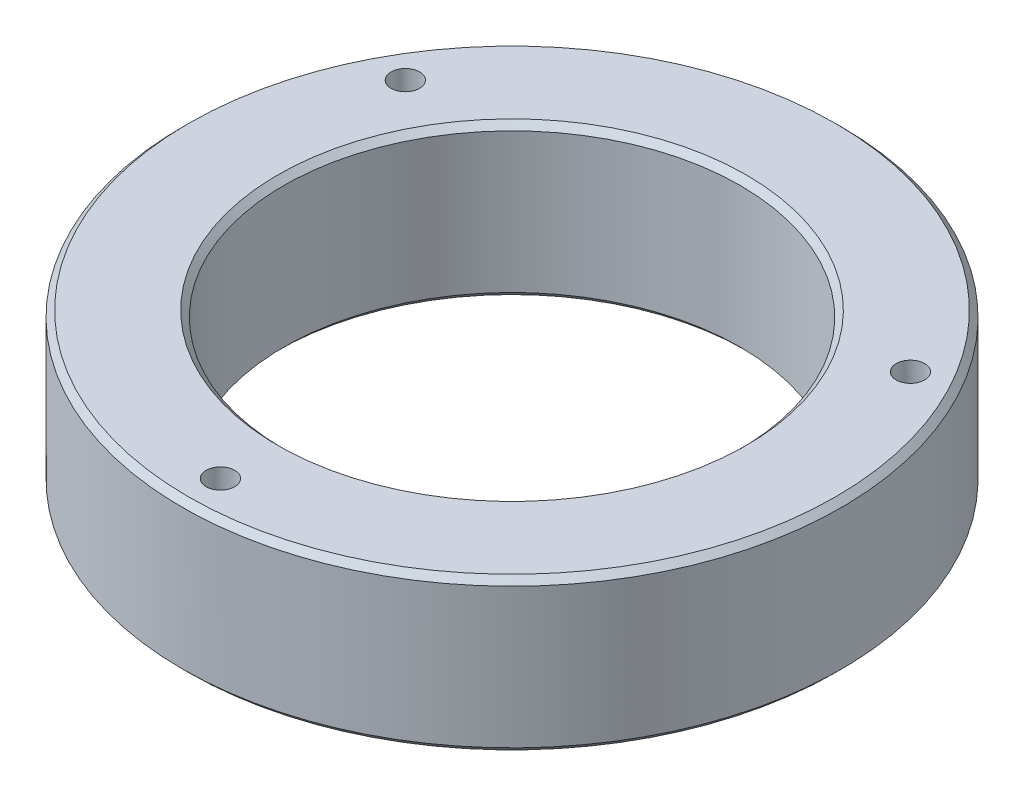
ISO-10303-21;
HEADER;
FILE_DESCRIPTION(('STEP AP214'),'2;1');
FILE_NAME('part.step','',(''),(''),'','','');
FILE_SCHEMA(('AUTOMOTIVE_DESIGN { 1 0 10303 214 1 1 1 1 }'));
ENDSEC;
DATA;
#1=APPLICATION_CONTEXT('core data for automotive mechanical design processes');
#2=APPLICATION_PROTOCOL_DEFINITION('international standard','automotive_design',2000,#1);
#3=PRODUCT_CONTEXT('',#1,'mechanical');
#4=PRODUCT('Part','Part','',(#3));
#5=PRODUCT_RELATED_PRODUCT_CATEGORY('part','',(#4));
#6=PRODUCT_DEFINITION_FORMATION('','',#4);
#7=PRODUCT_DEFINITION_CONTEXT('part definition',#1,'design');
#8=PRODUCT_DEFINITION('design','',#6,#7);
#9=PRODUCT_DEFINITION_SHAPE('','',#8);
#10=(LENGTH_UNIT() NAMED_UNIT(*) SI_UNIT(.MILLI.,.METRE.));
#11=(NAMED_UNIT(*) PLANE_ANGLE_UNIT() SI_UNIT($,.RADIAN.));
#12=(NAMED_UNIT(*) SI_UNIT($,.STERADIAN.) SOLID_ANGLE_UNIT());
#13=UNCERTAINTY_MEASURE_WITH_UNIT(LENGTH_MEASURE(1.E-05),#10,'distance_accuracy_value','');
#14=(GEOMETRIC_REPRESENTATION_CONTEXT(3) GLOBAL_UNCERTAINTY_ASSIGNED_CONTEXT((#13)) GLOBAL_UNIT_ASSIGNED_CONTEXT((#10,
#11,#12)) REPRESENTATION_CONTEXT('',''));
#15=CARTESIAN_POINT('',(0.,0.,0.));
#16=DIRECTION('',(0.,0.,1.));
#17=DIRECTION('',(1.,0.,0.));
#18=AXIS2_PLACEMENT_3D('',#15,#16,#17);
#19=CARTESIAN_POINT('',(-57.15,-19.05,0.));
#20=DIRECTION('',(0.,1.,0.));
#21=DIRECTION('',(0.,0.,1.));
#22=AXIS2_PLACEMENT_3D('',#19,#20,#21);
#23=PLANE('',#22);
#24=CARTESIAN_POINT('',(-69.85,-19.05,0.));
#25=DIRECTION('',(0.,1.,0.));
#26=DIRECTION('',(0.,0.,1.));
#27=AXIS2_PLACEMENT_3D('',#24,#25,#26);
#28=CIRCLE('',#27,3.96874999999999);
#29=CARTESIAN_POINT('',(-69.85,-19.05,3.96874999999999));
#30=VERTEX_POINT('',#29);
#31=EDGE_CURVE('E237',#30,#30,#28,.T.);
#32=ORIENTED_EDGE('',*,*,#31,.T.);
#33=EDGE_LOOP('',(#32));
#34=FACE_BOUND('',#33,.T.);
#35=CARTESIAN_POINT('',(69.85,-19.05,0.));
#36=DIRECTION('',(0.,1.,0.));
#37=DIRECTION('',(0.,0.,1.));
#38=AXIS2_PLACEMENT_3D('',#35,#36,#37);
#39=CIRCLE('',#38,3.96874999999999);
#40=CARTESIAN_POINT('',(69.85,-19.05,3.96874999999999));
#41=VERTEX_POINT('',#40);
#42=EDGE_CURVE('E96',#41,#41,#39,.T.);
#43=ORIENTED_EDGE('',*,*,#42,.T.);
#44=EDGE_LOOP('',(#43));
#45=FACE_BOUND('',#44,.T.);
#46=CARTESIAN_POINT('',(-63.246,-19.05,-36.5252));
#47=DIRECTION('',(0.,1.,0.));
#48=DIRECTION('',(0.,0.,1.));
#49=AXIS2_PLACEMENT_3D('',#46,#47,#48);
#50=CIRCLE('',#49,5.5626);
#51=CARTESIAN_POINT('',(-63.246,-19.05,-30.9626));
#52=VERTEX_POINT('',#51);
#53=EDGE_CURVE('E88',#52,#52,#50,.T.);
#54=ORIENTED_EDGE('',*,*,#53,.T.);
#55=EDGE_LOOP('',(#54));
#56=FACE_BOUND('',#55,.T.);
#57=CARTESIAN_POINT('',(63.246,-19.05,-36.5252));
#58=DIRECTION('',(0.,1.,0.));
#59=DIRECTION('',(0.,0.,1.));
#60=AXIS2_PLACEMENT_3D('',#57,#58,#59);
#61=CIRCLE('',#60,5.5626);
#62=CARTESIAN_POINT('',(63.246,-19.05,-30.9626));
#63=VERTEX_POINT('',#62);
#64=EDGE_CURVE('E78',#63,#63,#61,.T.);
#65=ORIENTED_EDGE('',*,*,#64,.T.);
#66=EDGE_LOOP('',(#65));
#67=FACE_BOUND('',#66,.T.);
#68=CARTESIAN_POINT('',(0.,-19.05,73.025));
#69=DIRECTION('',(0.,1.,0.));
#70=DIRECTION('',(0.,0.,1.));
#71=AXIS2_PLACEMENT_3D('',#68,#69,#70);
#72=CIRCLE('',#71,5.5626);
#73=CARTESIAN_POINT('',(0.,-19.05,78.5876));
#74=VERTEX_POINT('',#73);
#75=EDGE_CURVE('E72',#74,#74,#72,.T.);
#76=ORIENTED_EDGE('',*,*,#75,.T.);
#77=EDGE_LOOP('',(#76));
#78=FACE_BOUND('',#77,.T.);
#79=CARTESIAN_POINT('',(0.,-19.05,0.));
#80=DIRECTION('',(0.,1.,0.));
#81=DIRECTION('',(0.,0.,1.));
#82=AXIS2_PLACEMENT_3D('',#79,#80,#81);
#83=CIRCLE('',#82,58.674);
#84=CARTESIAN_POINT('',(0.,-19.05,-58.674));
#85=VERTEX_POINT('',#84);
#86=EDGE_CURVE('E57',#85,#85,#83,.T.);
#87=ORIENTED_EDGE('',*,*,#86,.T.);
#88=EDGE_LOOP('',(#87));
#89=FACE_BOUND('',#88,.T.);
#90=CARTESIAN_POINT('',(0.,-19.05,0.));
#91=DIRECTION('',(0.,1.,0.));
#92=DIRECTION('',(0.,0.,1.));
#93=AXIS2_PLACEMENT_3D('',#90,#91,#92);
#94=CIRCLE('',#93,81.0006);
#95=CARTESIAN_POINT('',(0.,-19.05,81.0006));
#96=VERTEX_POINT('',#95);
#97=EDGE_CURVE('E116',#96,#96,#94,.F.);
#98=ORIENTED_EDGE('',*,*,#97,.T.);
#99=EDGE_LOOP('',(#98));
#100=FACE_BOUND('',#99,.T.);
#101=ADVANCED_FACE('F43',(#34,#45,#56,#67,#78,#89,#100),#23,.F.);
#102=CARTESIAN_POINT('',(0.,-44.45,0.));
#103=DIRECTION('',(0.,-1.,0.));
#104=DIRECTION('',(0.,0.,-1.));
#105=AXIS2_PLACEMENT_3D('',#102,#103,#104);
#106=CYLINDRICAL_SURFACE('',#105,82.5246);
#107=CARTESIAN_POINT('',(0.,17.526,0.));
#108=DIRECTION('',(0.,-1.,0.));
#109=DIRECTION('',(0.,0.,-1.));
#110=AXIS2_PLACEMENT_3D('',#107,#108,#109);
#111=CIRCLE('',#110,82.5246);
#112=CARTESIAN_POINT('',(0.,17.526,-82.5246));
#113=VERTEX_POINT('',#112);
#114=EDGE_CURVE('E10',#113,#113,#111,.T.);
#115=ORIENTED_EDGE('',*,*,#114,.T.);
#116=EDGE_LOOP('',(#115));
#117=FACE_BOUND('',#116,.T.);
#118=CARTESIAN_POINT('',(0.,-17.526,0.));
#119=DIRECTION('',(0.,1.,0.));
#120=DIRECTION('',(0.,0.,1.));
#121=AXIS2_PLACEMENT_3D('',#118,#119,#120);
#122=CIRCLE('',#121,82.5246);
#123=CARTESIAN_POINT('',(0.,-17.526,82.5246));
#124=VERTEX_POINT('',#123);
#125=EDGE_CURVE('E52',#124,#124,#122,.T.);
#126=ORIENTED_EDGE('',*,*,#125,.T.);
#127=EDGE_LOOP('',(#126));
#128=FACE_BOUND('',#127,.T.);
#129=ADVANCED_FACE('F143',(#117,#128),#106,.T.);
#130=CARTESIAN_POINT('',(-82.5246,19.05,0.));
#131=DIRECTION('',(0.,-1.,0.));
#132=DIRECTION('',(0.,0.,-1.));
#133=AXIS2_PLACEMENT_3D('',#130,#131,#132);
#134=PLANE('',#133);
#135=CARTESIAN_POINT('',(-63.246,19.05,-36.5252));
#136=DIRECTION('',(0.,-1.,0.));
#137=DIRECTION('',(0.,0.,-1.));
#138=AXIS2_PLACEMENT_3D('',#135,#136,#137);
#139=CIRCLE('',#138,3.5687);
#140=CARTESIAN_POINT('',(-63.246,19.05,-40.0939));
#141=VERTEX_POINT('',#140);
#142=EDGE_CURVE('E76',#141,#141,#139,.F.);
#143=ORIENTED_EDGE('',*,*,#142,.F.);
#144=EDGE_LOOP('',(#143));
#145=FACE_BOUND('',#144,.T.);
#146=CARTESIAN_POINT('',(63.246,19.05,-36.5252));
#147=DIRECTION('',(0.,-1.,0.));
#148=DIRECTION('',(0.,0.,-1.));
#149=AXIS2_PLACEMENT_3D('',#146,#147,#148);
#150=CIRCLE('',#149,3.5687);
#151=CARTESIAN_POINT('',(63.246,19.05,-40.0939));
#152=VERTEX_POINT('',#151);
#153=EDGE_CURVE('E69',#152,#152,#150,.F.);
#154=ORIENTED_EDGE('',*,*,#153,.F.);
#155=EDGE_LOOP('',(#154));
#156=FACE_BOUND('',#155,.T.);
#157=CARTESIAN_POINT('',(0.,19.05,73.025));
#158=DIRECTION('',(0.,-1.,0.));
#159=DIRECTION('',(0.,0.,-1.));
#160=AXIS2_PLACEMENT_3D('',#157,#158,#159);
#161=CIRCLE('',#160,3.5687);
#162=CARTESIAN_POINT('',(0.,19.05,69.4563));
#163=VERTEX_POINT('',#162);
#164=EDGE_CURVE('E61',#163,#163,#161,.F.);
#165=ORIENTED_EDGE('',*,*,#164,.F.);
#166=EDGE_LOOP('',(#165));
#167=FACE_BOUND('',#166,.T.);
#168=CARTESIAN_POINT('',(0.,19.05,0.));
#169=DIRECTION('',(0.,-1.,0.));
#170=DIRECTION('',(0.,0.,-1.));
#171=AXIS2_PLACEMENT_3D('',#168,#169,#170);
#172=CIRCLE('',#171,58.674);
#173=CARTESIAN_POINT('',(0.,19.05,-58.674));
#174=VERTEX_POINT('',#173);
#175=EDGE_CURVE('E107',#174,#174,#172,.T.);
#176=ORIENTED_EDGE('',*,*,#175,.T.);
#177=EDGE_LOOP('',(#176));
#178=FACE_BOUND('',#177,.T.);
#179=CARTESIAN_POINT('',(0.,19.05,0.));
#180=DIRECTION('',(0.,-1.,0.));
#181=DIRECTION('',(0.,0.,-1.));
#182=AXIS2_PLACEMENT_3D('',#179,#180,#181);
#183=CIRCLE('',#182,81.0006);
#184=CARTESIAN_POINT('',(0.,19.05,-81.0006));
#185=VERTEX_POINT('',#184);
#186=EDGE_CURVE('E64',#185,#185,#183,.F.);
#187=ORIENTED_EDGE('',*,*,#186,.T.);
#188=EDGE_LOOP('',(#187));
#189=FACE_BOUND('',#188,.T.);
#190=ADVANCED_FACE('F133',(#145,#156,#167,#178,#189),#134,.F.);
#191=CARTESIAN_POINT('',(0.,-44.45,0.));
#192=DIRECTION('',(0.,-1.,0.));
#193=DIRECTION('',(0.,0.,-1.));
#194=AXIS2_PLACEMENT_3D('',#191,#192,#193);
#195=CYLINDRICAL_SURFACE('',#194,57.15);
#196=CARTESIAN_POINT('',(0.,17.526,0.));
#197=DIRECTION('',(0.,-1.,0.));
#198=DIRECTION('',(0.,0.,-1.));
#199=AXIS2_PLACEMENT_3D('',#196,#197,#198);
#200=CIRCLE('',#199,57.15);
#201=CARTESIAN_POINT('',(0.,17.526,-57.15));
#202=VERTEX_POINT('',#201);
#203=EDGE_CURVE('E113',#202,#202,#200,.F.);
#204=CARTESIAN_POINT('',(0.,-17.526,0.));
#205=DIRECTION('',(0.,1.,0.));
#206=DIRECTION('',(0.,0.,1.));
#207=AXIS2_PLACEMENT_3D('',#204,#205,#206);
#208=CIRCLE('',#207,57.15);
#209=CARTESIAN_POINT('',(0.,-17.526,-57.15));
#210=VERTEX_POINT('',#209);
#211=EDGE_CURVE('E110',#210,#210,#208,.F.);
#212=CARTESIAN_POINT('',(0.,17.526,-57.15));
#213=CARTESIAN_POINT('',(0.,17.160875,-57.15));
#214=CARTESIAN_POINT('',(0.,16.79575,-57.15));
#215=CARTESIAN_POINT('',(0.,16.0655,-57.15));
#216=CARTESIAN_POINT('',(0.,15.700375,-57.15));
#217=CARTESIAN_POINT('',(0.,14.970125,-57.15));
#218=CARTESIAN_POINT('',(0.,14.605,-57.15));
#219=CARTESIAN_POINT('',(0.,13.87475,-57.15));
#220=CARTESIAN_POINT('',(0.,13.509625,-57.15));
#221=CARTESIAN_POINT('',(0.,12.779375,-57.15));
#222=CARTESIAN_POINT('',(0.,12.41425,-57.15));
#223=CARTESIAN_POINT('',(0.,11.684,-57.15));
#224=CARTESIAN_POINT('',(0.,11.318875,-57.15));
#225=CARTESIAN_POINT('',(0.,10.588625,-57.15));
#226=CARTESIAN_POINT('',(0.,10.2235,-57.15));
#227=CARTESIAN_POINT('',(0.,9.49324999999998,-57.15));
#228=CARTESIAN_POINT('',(0.,9.12812499999998,-57.15));
#229=CARTESIAN_POINT('',(0.,8.39787499999998,-57.15));
#230=CARTESIAN_POINT('',(0.,8.03274999999998,-57.15));
#231=CARTESIAN_POINT('',(0.,7.30249999999998,-57.15));
#232=CARTESIAN_POINT('',(0.,6.93737499999998,-57.15));
#233=CARTESIAN_POINT('',(0.,6.20712499999998,-57.15));
#234=CARTESIAN_POINT('',(0.,5.84199999999998,-57.15));
#235=CARTESIAN_POINT('',(0.,5.11174999999998,-57.15));
#236=CARTESIAN_POINT('',(0.,4.74662499999998,-57.15));
#237=CARTESIAN_POINT('',(0.,4.01637499999998,-57.15));
#238=CARTESIAN_POINT('',(0.,3.65124999999998,-57.15));
#239=CARTESIAN_POINT('',(0.,2.92099999999998,-57.15));
#240=CARTESIAN_POINT('',(0.,2.55587499999998,-57.15));
#241=CARTESIAN_POINT('',(0.,1.82562499999998,-57.15));
#242=CARTESIAN_POINT('',(0.,1.46049999999998,-57.15));
#243=CARTESIAN_POINT('',(0.,0.730249999999976,-57.15));
#244=CARTESIAN_POINT('',(0.,0.365124999999978,-57.15));
#245=CARTESIAN_POINT('',(0.,-0.365125000000019,-57.15));
#246=CARTESIAN_POINT('',(0.,-0.730250000000018,-57.15));
#247=CARTESIAN_POINT('',(0.,-1.46050000000002,-57.15));
#248=CARTESIAN_POINT('',(0.,-1.82562500000002,-57.15));
#249=CARTESIAN_POINT('',(0.,-2.55587500000002,-57.15));
#250=CARTESIAN_POINT('',(0.,-2.92100000000002,-57.15));
#251=CARTESIAN_POINT('',(0.,-3.65125000000002,-57.15));
#252=CARTESIAN_POINT('',(0.,-4.01637500000002,-57.15));
#253=CARTESIAN_POINT('',(0.,-4.74662500000002,-57.15));
#254=CARTESIAN_POINT('',(0.,-5.11175000000002,-57.15));
#255=CARTESIAN_POINT('',(0.,-5.84200000000002,-57.15));
#256=CARTESIAN_POINT('',(0.,-6.20712500000002,-57.15));
#257=CARTESIAN_POINT('',(0.,-6.93737500000002,-57.15));
#258=CARTESIAN_POINT('',(0.,-7.30250000000002,-57.15));
#259=CARTESIAN_POINT('',(0.,-8.03275000000002,-57.15));
#260=CARTESIAN_POINT('',(0.,-8.39787500000002,-57.15));
#261=CARTESIAN_POINT('',(0.,-9.12812500000002,-57.15));
#262=CARTESIAN_POINT('',(0.,-9.49325000000002,-57.15));
#263=CARTESIAN_POINT('',(0.,-10.2235,-57.15));
#264=CARTESIAN_POINT('',(0.,-10.588625,-57.15));
#265=CARTESIAN_POINT('',(0.,-11.318875,-57.15));
#266=CARTESIAN_POINT('',(0.,-11.684,-57.15));
#267=CARTESIAN_POINT('',(0.,-12.41425,-57.15));
#268=CARTESIAN_POINT('',(0.,-12.779375,-57.15));
#269=CARTESIAN_POINT('',(0.,-13.509625,-57.15));
#270=CARTESIAN_POINT('',(0.,-13.87475,-57.15));
#271=CARTESIAN_POINT('',(0.,-14.605,-57.15));
#272=CARTESIAN_POINT('',(0.,-14.970125,-57.15));
#273=CARTESIAN_POINT('',(0.,-15.700375,-57.15));
#274=CARTESIAN_POINT('',(0.,-16.0655,-57.15));
#275=CARTESIAN_POINT('',(0.,-16.79575,-57.15));
#276=CARTESIAN_POINT('',(0.,-17.160875,-57.15));
#277=CARTESIAN_POINT('',(0.,-17.526,-57.15));
#278=B_SPLINE_CURVE_WITH_KNOTS('',3,(#212,#213,#214,#215,#216,#217,#218,#219,#220,#221,#222,
#223,#224,#225,#226,#227,#228,#229,#230,#231,#232,#233,#234,#235,#236,#237,#238,#239,#240,#241,
#242,#243,#244,#245,#246,#247,#248,#249,#250,#251,#252,#253,#254,#255,#256,#257,#258,#259,#260,
#261,#262,#263,#264,#265,#266,#267,#268,#269,#270,#271,#272,#273,#274,#275,#276,#277),
.UNSPECIFIED.,.F.,.F.,(4,2,2,2,2,2,2,2,2,2,2,2,2,2,2,2,2,2,2,2,2,2,2,2,2,2,2,2,2,2,2,2,4),(0.,
1.095375,2.19075,3.286125,4.3815,5.476875,6.57225,7.667625,8.763,9.858375,10.95375,12.049125,
13.1445,14.239875,15.33525,16.430625,17.526,18.621375,19.71675,20.812125,21.9075,23.002875,
24.09825,25.193625,26.289,27.384375,28.47975,29.575125,30.6705,31.765875,32.86125,33.956625,
35.052),.UNSPECIFIED.);
#279=EDGE_CURVE('BSEAM131',#202,#210,#278,.T.);
#280=ORIENTED_EDGE('',*,*,#203,.T.);
#281=ORIENTED_EDGE('',*,*,#211,.T.);
#282=ORIENTED_EDGE('',*,*,#279,.T.);
#283=ORIENTED_EDGE('',*,*,#279,.F.);
#284=EDGE_LOOP('',(#280,#282,#281,#283));
#285=FACE_BOUND('',#284,.T.);
#286=ADVANCED_FACE('F131',(#285),#195,.F.);
#287=CARTESIAN_POINT('',(0.,19.05,0.));
#288=DIRECTION('',(0.,1.,0.));
#289=DIRECTION('',(0.,0.,1.));
#290=AXIS2_PLACEMENT_3D('',#287,#288,#289);
#291=CONICAL_SURFACE('',#290,58.674,0.785398163397435);
#292=ORIENTED_EDGE('',*,*,#203,.F.);
#293=EDGE_LOOP('',(#292));
#294=FACE_BOUND('',#293,.T.);
#295=ORIENTED_EDGE('',*,*,#175,.F.);
#296=EDGE_LOOP('',(#295));
#297=FACE_BOUND('',#296,.T.);
#298=ADVANCED_FACE('F127',(#294,#297),#291,.F.);
#299=CARTESIAN_POINT('',(0.,-17.526,0.));
#300=DIRECTION('',(0.,-1.,0.));
#301=DIRECTION('',(0.,0.,-1.));
#302=AXIS2_PLACEMENT_3D('',#299,#300,#301);
#303=CONICAL_SURFACE('',#302,57.15,0.785398163397451);
#304=CARTESIAN_POINT('',(0.,-19.05,-58.674));
#305=CARTESIAN_POINT('',(0.,-19.034125,-58.658125));
#306=CARTESIAN_POINT('',(0.,-19.01825,-58.64225));
#307=CARTESIAN_POINT('',(0.,-18.9865,-58.6105));
#308=CARTESIAN_POINT('',(0.,-18.970625,-58.594625));
#309=CARTESIAN_POINT('',(0.,-18.938875,-58.562875));
#310=CARTESIAN_POINT('',(0.,-18.923,-58.547));
#311=CARTESIAN_POINT('',(0.,-18.89125,-58.51525));
#312=CARTESIAN_POINT('',(0.,-18.875375,-58.499375));
#313=CARTESIAN_POINT('',(0.,-18.843625,-58.467625));
#314=CARTESIAN_POINT('',(0.,-18.82775,-58.45175));
#315=CARTESIAN_POINT('',(0.,-18.796,-58.42));
#316=CARTESIAN_POINT('',(0.,-18.780125,-58.404125));
#317=CARTESIAN_POINT('',(0.,-18.748375,-58.372375));
#318=CARTESIAN_POINT('',(0.,-18.7325,-58.3565));
#319=CARTESIAN_POINT('',(0.,-18.70075,-58.32475));
#320=CARTESIAN_POINT('',(0.,-18.684875,-58.308875));
#321=CARTESIAN_POINT('',(0.,-18.653125,-58.277125));
#322=CARTESIAN_POINT('',(0.,-18.63725,-58.26125));
#323=CARTESIAN_POINT('',(0.,-18.6055,-58.2295));
#324=CARTESIAN_POINT('',(0.,-18.589625,-58.213625));
#325=CARTESIAN_POINT('',(0.,-18.557875,-58.181875));
#326=CARTESIAN_POINT('',(0.,-18.542,-58.166));
#327=CARTESIAN_POINT('',(0.,-18.51025,-58.13425));
#328=CARTESIAN_POINT('',(0.,-18.494375,-58.118375));
#329=CARTESIAN_POINT('',(0.,-18.462625,-58.086625));
#330=CARTESIAN_POINT('',(0.,-18.44675,-58.07075));
#331=CARTESIAN_POINT('',(0.,-18.415,-58.039));
#332=CARTESIAN_POINT('',(0.,-18.399125,-58.023125));
#333=CARTESIAN_POINT('',(0.,-18.367375,-57.991375));
#334=CARTESIAN_POINT('',(0.,-18.3515,-57.9755));
#335=CARTESIAN_POINT('',(0.,-18.31975,-57.94375));
#336=CARTESIAN_POINT('',(0.,-18.303875,-57.927875));
#337=CARTESIAN_POINT('',(0.,-18.272125,-57.896125));
#338=CARTESIAN_POINT('',(0.,-18.25625,-57.88025));
#339=CARTESIAN_POINT('',(0.,-18.2245,-57.8485));
#340=CARTESIAN_POINT('',(0.,-18.208625,-57.832625));
#341=CARTESIAN_POINT('',(0.,-18.176875,-57.800875));
#342=CARTESIAN_POINT('',(0.,-18.161,-57.785));
#343=CARTESIAN_POINT('',(0.,-18.12925,-57.75325));
#344=CARTESIAN_POINT('',(0.,-18.113375,-57.737375));
#345=CARTESIAN_POINT('',(0.,-18.081625,-57.705625));
#346=CARTESIAN_POINT('',(0.,-18.06575,-57.68975));
#347=CARTESIAN_POINT('',(0.,-18.034,-57.658));
#348=CARTESIAN_POINT('',(0.,-18.018125,-57.642125));
#349=CARTESIAN_POINT('',(0.,-17.986375,-57.610375));
#350=CARTESIAN_POINT('',(0.,-17.9705,-57.5945));
#351=CARTESIAN_POINT('',(0.,-17.93875,-57.56275));
#352=CARTESIAN_POINT('',(0.,-17.922875,-57.546875));
#353=CARTESIAN_POINT('',(0.,-17.891125,-57.515125));
#354=CARTESIAN_POINT('',(0.,-17.87525,-57.49925));
#355=CARTESIAN_POINT('',(0.,-17.8435,-57.4675));
#356=CARTESIAN_POINT('',(0.,-17.827625,-57.451625));
#357=CARTESIAN_POINT('',(0.,-17.795875,-57.419875));
#358=CARTESIAN_POINT('',(0.,-17.78,-57.404));
#359=CARTESIAN_POINT('',(0.,-17.74825,-57.37225));
#360=CARTESIAN_POINT('',(0.,-17.732375,-57.356375));
#361=CARTESIAN_POINT('',(0.,-17.700625,-57.324625));
#362=CARTESIAN_POINT('',(0.,-17.68475,-57.30875));
#363=CARTESIAN_POINT('',(0.,-17.653,-57.277));
#364=CARTESIAN_POINT('',(0.,-17.637125,-57.261125));
#365=CARTESIAN_POINT('',(0.,-17.605375,-57.229375));
#366=CARTESIAN_POINT('',(0.,-17.5895,-57.2135));
#367=CARTESIAN_POINT('',(0.,-17.55775,-57.18175));
#368=CARTESIAN_POINT('',(0.,-17.541875,-57.165875));
#369=CARTESIAN_POINT('',(0.,-17.526,-57.15));
#370=B_SPLINE_CURVE_WITH_KNOTS('',3,(#304,#305,#306,#307,#308,#309,#310,#311,#312,#313,#314,
#315,#316,#317,#318,#319,#320,#321,#322,#323,#324,#325,#326,#327,#328,#329,#330,#331,#332,#333,
#334,#335,#336,#337,#338,#339,#340,#341,#342,#343,#344,#345,#346,#347,#348,#349,#350,#351,#352,
#353,#354,#355,#356,#357,#358,#359,#360,#361,#362,#363,#364,#365,#366,#367,#368,#369),
.UNSPECIFIED.,.F.,.F.,(4,2,2,2,2,2,2,2,2,2,2,2,2,2,2,2,2,2,2,2,2,2,2,2,2,2,2,2,2,2,2,2,4),(0.,
0.0673519209080149,0.134703841816037,0.202055762724052,0.269407683632072,0.336759604540087,
0.404111525448106,0.471463446356126,0.538815367264141,0.606167288172161,0.673519209080176,
0.740871129988195,0.80822305089621,0.87557497180423,0.94292689271225,1.01027881362026,
1.07763073452828,1.1449826554363,1.21233457634432,1.27968649725234,1.34703841816036,
1.41439033906838,1.48174225997639,1.54909418088441,1.61644610179242,1.68379802270044,
1.75114994360846,1.81850186451648,1.88585378542449,1.95320570633251,2.02055762724053,
2.08790954814855,2.15526146905657),.UNSPECIFIED.);
#371=EDGE_CURVE('BSEAM123',#85,#210,#370,.T.);
#372=ORIENTED_EDGE('',*,*,#86,.F.);
#373=ORIENTED_EDGE('',*,*,#211,.F.);
#374=ORIENTED_EDGE('',*,*,#371,.T.);
#375=ORIENTED_EDGE('',*,*,#371,.F.);
#376=EDGE_LOOP('',(#372,#374,#373,#375));
#377=FACE_BOUND('',#376,.T.);
#378=ADVANCED_FACE('F123',(#377),#303,.F.);
#379=CARTESIAN_POINT('',(0.,17.526,0.));
#380=DIRECTION('',(0.,-1.,0.));
#381=DIRECTION('',(0.,0.,-1.));
#382=AXIS2_PLACEMENT_3D('',#379,#380,#381);
#383=CONICAL_SURFACE('',#382,82.5246,0.785398163397451);
#384=ORIENTED_EDGE('',*,*,#186,.F.);
#385=EDGE_LOOP('',(#384));
#386=FACE_BOUND('',#385,.T.);
#387=ORIENTED_EDGE('',*,*,#114,.F.);
#388=EDGE_LOOP('',(#387));
#389=FACE_BOUND('',#388,.T.);
#390=ADVANCED_FACE('F126',(#386,#389),#383,.T.);
#391=CARTESIAN_POINT('',(0.,-19.05,0.));
#392=DIRECTION('',(0.,1.,0.));
#393=DIRECTION('',(0.,0.,1.));
#394=AXIS2_PLACEMENT_3D('',#391,#392,#393);
#395=CONICAL_SURFACE('',#394,81.0006,0.785398163397448);
#396=ORIENTED_EDGE('',*,*,#125,.F.);
#397=EDGE_LOOP('',(#396));
#398=FACE_BOUND('',#397,.T.);
#399=ORIENTED_EDGE('',*,*,#97,.F.);
#400=EDGE_LOOP('',(#399));
#401=FACE_BOUND('',#400,.T.);
#402=ADVANCED_FACE('F46',(#398,#401),#395,.T.);
#403=CARTESIAN_POINT('',(0.,57.15,73.025));
#404=DIRECTION('',(0.,-1.,0.));
#405=DIRECTION('',(0.,0.,-1.));
#406=AXIS2_PLACEMENT_3D('',#403,#404,#405);
#407=CYLINDRICAL_SURFACE('',#406,3.5687);
#408=CARTESIAN_POINT('',(0.,-9.398,73.025));
#409=DIRECTION('',(0.,1.,0.));
#410=DIRECTION('',(0.,0.,1.));
#411=AXIS2_PLACEMENT_3D('',#408,#409,#410);
#412=CIRCLE('',#411,3.5687);
#413=CARTESIAN_POINT('',(0.,-9.398,76.5937));
#414=VERTEX_POINT('',#413);
#415=EDGE_CURVE('E65',#414,#414,#412,.T.);
#416=ORIENTED_EDGE('',*,*,#415,.F.);
#417=EDGE_LOOP('',(#416));
#418=FACE_BOUND('',#417,.T.);
#419=ORIENTED_EDGE('',*,*,#164,.T.);
#420=EDGE_LOOP('',(#419));
#421=FACE_BOUND('',#420,.T.);
#422=ADVANCED_FACE('F171',(#418,#421),#407,.F.);
#423=CARTESIAN_POINT('',(0.,-9.398,73.025));
#424=DIRECTION('',(0.,-1.,0.));
#425=DIRECTION('',(0.,0.,-1.));
#426=AXIS2_PLACEMENT_3D('',#423,#424,#425);
#427=CYLINDRICAL_SURFACE('',#426,5.5626);
#428=CARTESIAN_POINT('',(0.,-9.398,73.025));
#429=DIRECTION('',(0.,1.,0.));
#430=DIRECTION('',(0.,0.,1.));
#431=AXIS2_PLACEMENT_3D('',#428,#429,#430);
#432=CIRCLE('',#431,5.5626);
#433=CARTESIAN_POINT('',(0.,-9.398,78.5876));
#434=VERTEX_POINT('',#433);
#435=EDGE_CURVE('E68',#434,#434,#432,.T.);
#436=ORIENTED_EDGE('',*,*,#435,.T.);
#437=EDGE_LOOP('',(#436));
#438=FACE_BOUND('',#437,.T.);
#439=ORIENTED_EDGE('',*,*,#75,.F.);
#440=EDGE_LOOP('',(#439));
#441=FACE_BOUND('',#440,.T.);
#442=ADVANCED_FACE('F179',(#438,#441),#427,.F.);
#443=CARTESIAN_POINT('',(0.,-9.398,73.025));
#444=DIRECTION('',(0.,1.,0.));
#445=DIRECTION('',(0.,0.,1.));
#446=AXIS2_PLACEMENT_3D('',#443,#444,#445);
#447=PLANE('',#446);
#448=ORIENTED_EDGE('',*,*,#415,.T.);
#449=EDGE_LOOP('',(#448));
#450=FACE_BOUND('',#449,.T.);
#451=ORIENTED_EDGE('',*,*,#435,.F.);
#452=EDGE_LOOP('',(#451));
#453=FACE_BOUND('',#452,.T.);
#454=ADVANCED_FACE('F188',(#450,#453),#447,.F.);
#455=CARTESIAN_POINT('',(63.246,57.15,-36.5252));
#456=DIRECTION('',(0.,-1.,0.));
#457=DIRECTION('',(0.,0.,-1.));
#458=AXIS2_PLACEMENT_3D('',#455,#456,#457);
#459=CYLINDRICAL_SURFACE('',#458,3.5687);
#460=CARTESIAN_POINT('',(63.246,-9.398,-36.5252));
#461=DIRECTION('',(0.,1.,0.));
#462=DIRECTION('',(0.,0.,1.));
#463=AXIS2_PLACEMENT_3D('',#460,#461,#462);
#464=CIRCLE('',#463,3.5687);
#465=CARTESIAN_POINT('',(63.246,-9.398,-32.9565));
#466=VERTEX_POINT('',#465);
#467=EDGE_CURVE('E73',#466,#466,#464,.T.);
#468=ORIENTED_EDGE('',*,*,#467,.F.);
#469=EDGE_LOOP('',(#468));
#470=FACE_BOUND('',#469,.T.);
#471=ORIENTED_EDGE('',*,*,#153,.T.);
#472=EDGE_LOOP('',(#471));
#473=FACE_BOUND('',#472,.T.);
#474=ADVANCED_FACE('F196',(#470,#473),#459,.F.);
#475=CARTESIAN_POINT('',(63.246,-9.398,-36.5252));
#476=DIRECTION('',(0.,-1.,0.));
#477=DIRECTION('',(0.,0.,-1.));
#478=AXIS2_PLACEMENT_3D('',#475,#476,#477);
#479=CYLINDRICAL_SURFACE('',#478,5.5626);
#480=CARTESIAN_POINT('',(63.246,-9.398,-36.5252));
#481=DIRECTION('',(0.,1.,0.));
#482=DIRECTION('',(0.,0.,1.));
#483=AXIS2_PLACEMENT_3D('',#480,#481,#482);
#484=CIRCLE('',#483,5.5626);
#485=CARTESIAN_POINT('',(63.246,-9.398,-30.9626));
#486=VERTEX_POINT('',#485);
#487=EDGE_CURVE('E75',#486,#486,#484,.T.);
#488=ORIENTED_EDGE('',*,*,#487,.T.);
#489=EDGE_LOOP('',(#488));
#490=FACE_BOUND('',#489,.T.);
#491=ORIENTED_EDGE('',*,*,#64,.F.);
#492=EDGE_LOOP('',(#491));
#493=FACE_BOUND('',#492,.T.);
#494=ADVANCED_FACE('F200',(#490,#493),#479,.F.);
#495=CARTESIAN_POINT('',(63.246,-9.398,-36.5252));
#496=DIRECTION('',(0.,1.,0.));
#497=DIRECTION('',(0.,0.,1.));
#498=AXIS2_PLACEMENT_3D('',#495,#496,#497);
#499=PLANE('',#498);
#500=ORIENTED_EDGE('',*,*,#467,.T.);
#501=EDGE_LOOP('',(#500));
#502=FACE_BOUND('',#501,.T.);
#503=ORIENTED_EDGE('',*,*,#487,.F.);
#504=EDGE_LOOP('',(#503));
#505=FACE_BOUND('',#504,.T.);
#506=ADVANCED_FACE('F204',(#502,#505),#499,.F.);
#507=CARTESIAN_POINT('',(-63.246,57.15,-36.5252));
#508=DIRECTION('',(0.,-1.,0.));
#509=DIRECTION('',(0.,0.,-1.));
#510=AXIS2_PLACEMENT_3D('',#507,#508,#509);
#511=CYLINDRICAL_SURFACE('',#510,3.5687);
#512=CARTESIAN_POINT('',(-63.246,-9.398,-36.5252));
#513=DIRECTION('',(0.,1.,0.));
#514=DIRECTION('',(0.,0.,1.));
#515=AXIS2_PLACEMENT_3D('',#512,#513,#514);
#516=CIRCLE('',#515,3.5687);
#517=CARTESIAN_POINT('',(-63.246,-9.398,-32.9565));
#518=VERTEX_POINT('',#517);
#519=EDGE_CURVE('E48',#518,#518,#516,.T.);
#520=ORIENTED_EDGE('',*,*,#519,.F.);
#521=EDGE_LOOP('',(#520));
#522=FACE_BOUND('',#521,.T.);
#523=ORIENTED_EDGE('',*,*,#142,.T.);
#524=EDGE_LOOP('',(#523));
#525=FACE_BOUND('',#524,.T.);
#526=ADVANCED_FACE('F208',(#522,#525),#511,.F.);
#527=CARTESIAN_POINT('',(-63.246,-9.398,-36.5252));
#528=DIRECTION('',(0.,-1.,0.));
#529=DIRECTION('',(0.,0.,-1.));
#530=AXIS2_PLACEMENT_3D('',#527,#528,#529);
#531=CYLINDRICAL_SURFACE('',#530,5.5626);
#532=CARTESIAN_POINT('',(-63.246,-9.398,-36.5252));
#533=DIRECTION('',(0.,1.,0.));
#534=DIRECTION('',(0.,0.,1.));
#535=AXIS2_PLACEMENT_3D('',#532,#533,#534);
#536=CIRCLE('',#535,5.5626);
#537=CARTESIAN_POINT('',(-63.246,-9.398,-30.9626));
#538=VERTEX_POINT('',#537);
#539=EDGE_CURVE('E84',#538,#538,#536,.T.);
#540=ORIENTED_EDGE('',*,*,#539,.T.);
#541=EDGE_LOOP('',(#540));
#542=FACE_BOUND('',#541,.T.);
#543=ORIENTED_EDGE('',*,*,#53,.F.);
#544=EDGE_LOOP('',(#543));
#545=FACE_BOUND('',#544,.T.);
#546=ADVANCED_FACE('F212',(#542,#545),#531,.F.);
#547=CARTESIAN_POINT('',(-63.246,-9.398,-36.5252));
#548=DIRECTION('',(0.,1.,0.));
#549=DIRECTION('',(0.,0.,1.));
#550=AXIS2_PLACEMENT_3D('',#547,#548,#549);
#551=PLANE('',#550);
#552=ORIENTED_EDGE('',*,*,#519,.T.);
#553=EDGE_LOOP('',(#552));
#554=FACE_BOUND('',#553,.T.);
#555=ORIENTED_EDGE('',*,*,#539,.F.);
#556=EDGE_LOOP('',(#555));
#557=FACE_BOUND('',#556,.T.);
#558=ADVANCED_FACE('F216',(#554,#557),#551,.F.);
#559=CARTESIAN_POINT('',(69.85,6.35,0.));
#560=DIRECTION('',(0.,-1.,0.));
#561=DIRECTION('',(0.,0.,-1.));
#562=AXIS2_PLACEMENT_3D('',#559,#560,#561);
#563=CYLINDRICAL_SURFACE('',#562,3.96874999999999);
#564=CARTESIAN_POINT('',(69.85,6.35,0.));
#565=DIRECTION('',(0.,1.,0.));
#566=DIRECTION('',(0.,0.,1.));
#567=AXIS2_PLACEMENT_3D('',#564,#565,#566);
#568=CIRCLE('',#567,3.96874999999999);
#569=CARTESIAN_POINT('',(69.85,6.35,3.96874999999999));
#570=VERTEX_POINT('',#569);
#571=EDGE_CURVE('E93',#570,#570,#568,.T.);
#572=ORIENTED_EDGE('',*,*,#571,.T.);
#573=EDGE_LOOP('',(#572));
#574=FACE_BOUND('',#573,.T.);
#575=ORIENTED_EDGE('',*,*,#42,.F.);
#576=EDGE_LOOP('',(#575));
#577=FACE_BOUND('',#576,.T.);
#578=ADVANCED_FACE('F219',(#574,#577),#563,.F.);
#579=CARTESIAN_POINT('',(69.85,6.35,0.));
#580=DIRECTION('',(0.,1.,0.));
#581=DIRECTION('',(0.,0.,1.));
#582=AXIS2_PLACEMENT_3D('',#579,#580,#581);
#583=PLANE('',#582);
#584=ORIENTED_EDGE('',*,*,#571,.F.);
#585=EDGE_LOOP('',(#584));
#586=FACE_BOUND('',#585,.T.);
#587=ADVANCED_FACE('F222',(#586),#583,.F.);
#588=CARTESIAN_POINT('',(-69.85,6.35,0.));
#589=DIRECTION('',(0.,-1.,0.));
#590=DIRECTION('',(0.,0.,-1.));
#591=AXIS2_PLACEMENT_3D('',#588,#589,#590);
#592=CYLINDRICAL_SURFACE('',#591,3.96874999999999);
#593=CARTESIAN_POINT('',(-69.85,6.35,0.));
#594=DIRECTION('',(0.,1.,0.));
#595=DIRECTION('',(0.,0.,1.));
#596=AXIS2_PLACEMENT_3D('',#593,#594,#595);
#597=CIRCLE('',#596,3.96874999999999);
#598=CARTESIAN_POINT('',(-69.85,6.35,3.96874999999999));
#599=VERTEX_POINT('',#598);
#600=EDGE_CURVE('E236',#599,#599,#597,.T.);
#601=ORIENTED_EDGE('',*,*,#600,.T.);
#602=EDGE_LOOP('',(#601));
#603=FACE_BOUND('',#602,.T.);
#604=ORIENTED_EDGE('',*,*,#31,.F.);
#605=EDGE_LOOP('',(#604));
#606=FACE_BOUND('',#605,.T.);
#607=ADVANCED_FACE('F225',(#603,#606),#592,.F.);
#608=CARTESIAN_POINT('',(-69.85,6.35,0.));
#609=DIRECTION('',(0.,1.,0.));
#610=DIRECTION('',(0.,0.,1.));
#611=AXIS2_PLACEMENT_3D('',#608,#609,#610);
#612=PLANE('',#611);
#613=ORIENTED_EDGE('',*,*,#600,.F.);
#614=EDGE_LOOP('',(#613));
#615=FACE_BOUND('',#614,.T.);
#616=ADVANCED_FACE('F228',(#615),#612,.F.);
#617=CLOSED_SHELL('',(#101,#129,#190,#286,#298,#378,#390,#402,#422,#442,#454,#474,#494,#506,
#526,#546,#558,#578,#587,#607,#616));
#618=MANIFOLD_SOLID_BREP('B2',#617);
#619=ADVANCED_BREP_SHAPE_REPRESENTATION('',(#18,#618),#14);
#620=SHAPE_DEFINITION_REPRESENTATION(#9,#619);
ENDSEC;
END-ISO-10303-21;
